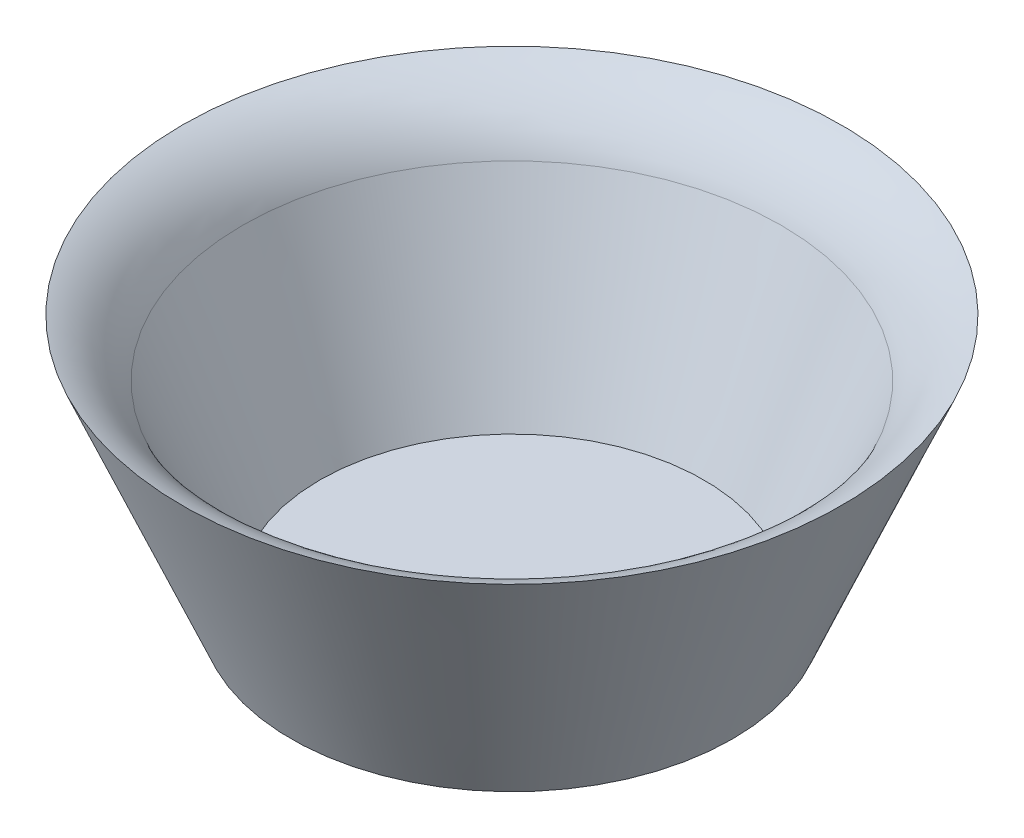
ISO-10303-21;
HEADER;
FILE_DESCRIPTION(('STEP AP214'),'2;1');
FILE_NAME('part.step','',(''),(''),'','','');
FILE_SCHEMA(('AUTOMOTIVE_DESIGN { 1 0 10303 214 1 1 1 1 }'));
ENDSEC;
DATA;
#1=APPLICATION_CONTEXT('core data for automotive mechanical design processes');
#2=APPLICATION_PROTOCOL_DEFINITION('international standard','automotive_design',2000,#1);
#3=PRODUCT_CONTEXT('',#1,'mechanical');
#4=PRODUCT('Part','Part','',(#3));
#5=PRODUCT_RELATED_PRODUCT_CATEGORY('part','',(#4));
#6=PRODUCT_DEFINITION_FORMATION('','',#4);
#7=PRODUCT_DEFINITION_CONTEXT('part definition',#1,'design');
#8=PRODUCT_DEFINITION('design','',#6,#7);
#9=PRODUCT_DEFINITION_SHAPE('','',#8);
#10=(LENGTH_UNIT() NAMED_UNIT(*) SI_UNIT(.MILLI.,.METRE.));
#11=(NAMED_UNIT(*) PLANE_ANGLE_UNIT() SI_UNIT($,.RADIAN.));
#12=(NAMED_UNIT(*) SI_UNIT($,.STERADIAN.) SOLID_ANGLE_UNIT());
#13=UNCERTAINTY_MEASURE_WITH_UNIT(LENGTH_MEASURE(1.E-05),#10,'distance_accuracy_value','');
#14=(GEOMETRIC_REPRESENTATION_CONTEXT(3) GLOBAL_UNCERTAINTY_ASSIGNED_CONTEXT((#13)) GLOBAL_UNIT_ASSIGNED_CONTEXT((#10,
#11,#12)) REPRESENTATION_CONTEXT('',''));
#15=CARTESIAN_POINT('',(0.,0.,0.));
#16=DIRECTION('',(0.,0.,1.));
#17=DIRECTION('',(1.,0.,0.));
#18=AXIS2_PLACEMENT_3D('',#15,#16,#17);
#19=CARTESIAN_POINT('',(-37.4243194035992,0.,0.));
#20=DIRECTION('',(0.,1.,0.));
#21=DIRECTION('',(-1.,0.,0.));
#22=AXIS2_PLACEMENT_3D('',#19,#20,#21);
#23=PLANE('',#22);
#24=CARTESIAN_POINT('',(0.,0.,0.));
#25=DIRECTION('',(0.,1.,0.));
#26=DIRECTION('',(-1.,0.,0.));
#27=AXIS2_PLACEMENT_3D('',#24,#25,#26);
#28=CIRCLE('',#27,37.4243194035992);
#29=CARTESIAN_POINT('',(-37.4243194035992,0.,0.));
#30=VERTEX_POINT('',#29);
#31=EDGE_CURVE('E49',#30,#30,#28,.T.);
#32=ORIENTED_EDGE('',*,*,#31,.T.);
#33=EDGE_LOOP('',(#32));
#34=FACE_BOUND('',#33,.T.);
#35=ADVANCED_FACE('F34',(#34),#23,.T.);
#36=CARTESIAN_POINT('',(0.,-3.5,0.));
#37=DIRECTION('',(0.,-1.,0.));
#38=DIRECTION('',(1.,0.,0.));
#39=AXIS2_PLACEMENT_3D('',#36,#37,#38);
#40=PLANE('',#39);
#41=CARTESIAN_POINT('',(0.,-3.5,0.));
#42=DIRECTION('',(0.,1.,0.));
#43=DIRECTION('',(-1.,0.,0.));
#44=AXIS2_PLACEMENT_3D('',#41,#42,#43);
#45=CIRCLE('',#44,43.);
#46=CARTESIAN_POINT('',(-43.,-3.5,0.));
#47=VERTEX_POINT('',#46);
#48=EDGE_CURVE('E41',#47,#47,#45,.T.);
#49=ORIENTED_EDGE('',*,*,#48,.F.);
#50=EDGE_LOOP('',(#49));
#51=FACE_BOUND('',#50,.T.);
#52=ADVANCED_FACE('F65',(#51),#40,.T.);
#53=CARTESIAN_POINT('',(0.,46.5,0.));
#54=DIRECTION('',(0.,1.,0.));
#55=DIRECTION('',(-1.,0.,0.));
#56=AXIS2_PLACEMENT_3D('',#53,#54,#55);
#57=CONICAL_SURFACE('',#56,64.2237408104801,0.401425727958693);
#58=ORIENTED_EDGE('',*,*,#48,.T.);
#59=EDGE_LOOP('',(#58));
#60=FACE_BOUND('',#59,.T.);
#61=CARTESIAN_POINT('',(0.,46.5,0.));
#62=DIRECTION('',(0.,1.,0.));
#63=DIRECTION('',(-1.,0.,0.));
#64=AXIS2_PLACEMENT_3D('',#61,#62,#63);
#65=CIRCLE('',#64,64.2237408104801);
#66=CARTESIAN_POINT('',(-64.2237408104801,46.5,0.));
#67=VERTEX_POINT('',#66);
#68=EDGE_CURVE('E45',#67,#67,#65,.T.);
#69=ORIENTED_EDGE('',*,*,#68,.F.);
#70=EDGE_LOOP('',(#69));
#71=FACE_BOUND('',#70,.T.);
#72=ADVANCED_FACE('F58',(#60,#71),#57,.T.);
#73=CARTESIAN_POINT('',(0.,0.,0.));
#74=DIRECTION('',(0.,1.,0.));
#75=DIRECTION('',(-1.,0.,0.));
#76=AXIS2_PLACEMENT_3D('',#73,#74,#75);
#77=CONICAL_SURFACE('',#76,37.4243194035992,0.401425727958693);
#78=CARTESIAN_POINT('',(0.,35.4564563403298,0.));
#79=DIRECTION('',(0.,1.,0.));
#80=DIRECTION('',(-1.,0.,0.));
#81=AXIS2_PLACEMENT_3D('',#78,#79,#80);
#82=CIRCLE('',#81,52.4746921921044);
#83=CARTESIAN_POINT('',(-52.4746921921044,35.4564563403297,0.));
#84=VERTEX_POINT('',#83);
#85=EDGE_CURVE('E10',#84,#84,#82,.T.);
#86=ORIENTED_EDGE('',*,*,#85,.T.);
#87=EDGE_LOOP('',(#86));
#88=FACE_BOUND('',#87,.T.);
#89=ORIENTED_EDGE('',*,*,#31,.F.);
#90=EDGE_LOOP('',(#89));
#91=FACE_BOUND('',#90,.T.);
#92=ADVANCED_FACE('F56',(#88,#91),#77,.F.);
#93=CARTESIAN_POINT('',(0.,27.6418337705443,0.));
#94=DIRECTION('',(0.,1.,0.));
#95=DIRECTION('',(-1.,0.,0.));
#96=AXIS2_PLACEMENT_3D('',#93,#94,#95);
#97=TOROIDAL_SURFACE('',#96,70.8847892611532,20.);
#98=ORIENTED_EDGE('',*,*,#68,.T.);
#99=EDGE_LOOP('',(#98));
#100=FACE_BOUND('',#99,.T.);
#101=ORIENTED_EDGE('',*,*,#85,.F.);
#102=EDGE_LOOP('',(#101));
#103=FACE_BOUND('',#102,.T.);
#104=ADVANCED_FACE('F36',(#100,#103),#97,.T.);
#105=CLOSED_SHELL('',(#35,#52,#72,#92,#104));
#106=MANIFOLD_SOLID_BREP('B2',#105);
#107=ADVANCED_BREP_SHAPE_REPRESENTATION('',(#18,#106),#14);
#108=SHAPE_DEFINITION_REPRESENTATION(#9,#107);
ENDSEC;
END-ISO-10303-21;
